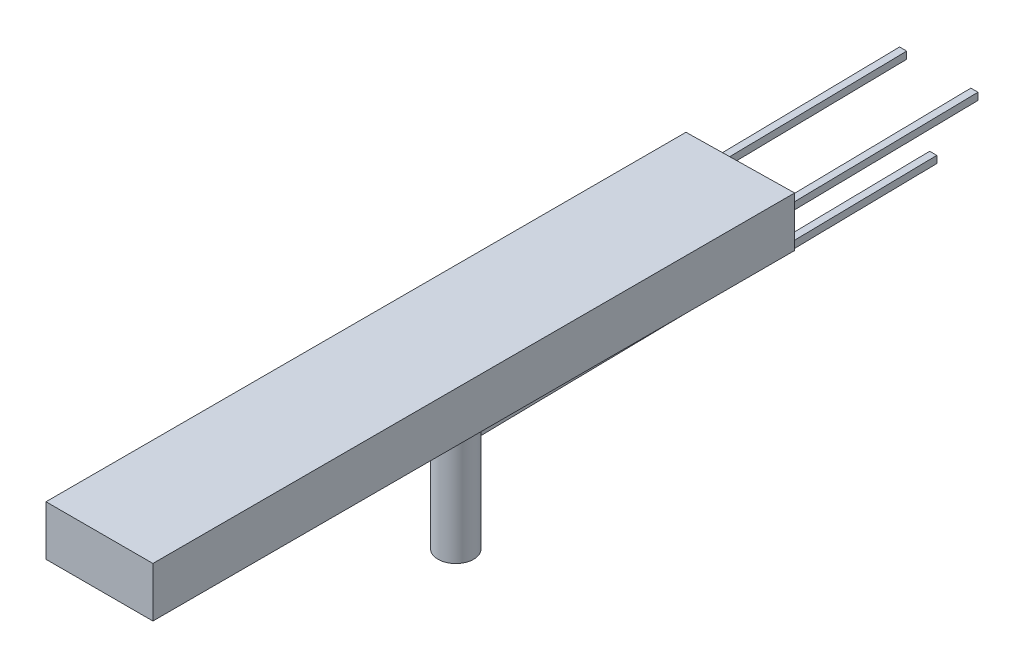
ISO-10303-21;
HEADER;
FILE_DESCRIPTION(('STEP AP214'),'2;1');
FILE_NAME('part.step','',(''),(''),'','','');
FILE_SCHEMA(('AUTOMOTIVE_DESIGN { 1 0 10303 214 1 1 1 1 }'));
ENDSEC;
DATA;
#1=APPLICATION_CONTEXT('core data for automotive mechanical design processes');
#2=APPLICATION_PROTOCOL_DEFINITION('international standard','automotive_design',2000,#1);
#3=PRODUCT_CONTEXT('',#1,'mechanical');
#4=PRODUCT('Part','Part','',(#3));
#5=PRODUCT_RELATED_PRODUCT_CATEGORY('part','',(#4));
#6=PRODUCT_DEFINITION_FORMATION('','',#4);
#7=PRODUCT_DEFINITION_CONTEXT('part definition',#1,'design');
#8=PRODUCT_DEFINITION('design','',#6,#7);
#9=PRODUCT_DEFINITION_SHAPE('','',#8);
#10=(LENGTH_UNIT() NAMED_UNIT(*) SI_UNIT(.MILLI.,.METRE.));
#11=(NAMED_UNIT(*) PLANE_ANGLE_UNIT() SI_UNIT($,.RADIAN.));
#12=(NAMED_UNIT(*) SI_UNIT($,.STERADIAN.) SOLID_ANGLE_UNIT());
#13=UNCERTAINTY_MEASURE_WITH_UNIT(LENGTH_MEASURE(1.E-05),#10,'distance_accuracy_value','');
#14=(GEOMETRIC_REPRESENTATION_CONTEXT(3) GLOBAL_UNCERTAINTY_ASSIGNED_CONTEXT((#13)) GLOBAL_UNIT_ASSIGNED_CONTEXT((#10,
#11,#12)) REPRESENTATION_CONTEXT('',''));
#15=CARTESIAN_POINT('',(0.,0.,0.));
#16=DIRECTION('',(0.,0.,1.));
#17=DIRECTION('',(1.,0.,0.));
#18=AXIS2_PLACEMENT_3D('',#15,#16,#17);
#19=CARTESIAN_POINT('',(6.7509066981884,11.8999999962747,14.9899999074595));
#20=DIRECTION('',(0.0165650611449047,0.,0.999862789961336));
#21=DIRECTION('',(0.999862789961336,0.,-0.0165650611449047));
#22=AXIS2_PLACEMENT_3D('',#19,#20,#21);
#23=PLANE('',#22);
#24=DIRECTION('',(0.,1.,0.));
#25=VECTOR('',#24,1.);
#26=CARTESIAN_POINT('',(1.09246615163893,11.8999999962747,15.0837451838909));
#27=LINE('',#26,#25);
#28=CARTESIAN_POINT('',(1.09246615163893,1.54829620804176,15.0837451838909));
#29=VERTEX_POINT('',#28);
#30=CARTESIAN_POINT('',(1.09246615163893,2.04829620804176,15.0837451838909));
#31=VERTEX_POINT('',#30);
#32=EDGE_CURVE('E257',#29,#31,#27,.T.);
#33=ORIENTED_EDGE('',*,*,#32,.F.);
#34=DIRECTION('',(0.999862789961335,0.,-0.0165650611449047));
#35=VECTOR('',#34,1.);
#36=CARTESIAN_POINT('',(6.7509066981884,1.54829620804176,14.9899999074595));
#37=LINE('',#36,#35);
#38=CARTESIAN_POINT('',(1.5923975466196,1.54829620804176,15.0754626533185));
#39=VERTEX_POINT('',#38);
#40=EDGE_CURVE('E255',#29,#39,#37,.T.);
#41=ORIENTED_EDGE('',*,*,#40,.T.);
#42=DIRECTION('',(0.,1.,0.));
#43=VECTOR('',#42,1.);
#44=CARTESIAN_POINT('',(1.5923975466196,11.8999999962747,15.0754626533185));
#45=LINE('',#44,#43);
#46=CARTESIAN_POINT('',(1.5923975466196,2.04829620804176,15.0754626533185));
#47=VERTEX_POINT('',#46);
#48=EDGE_CURVE('E253',#39,#47,#45,.T.);
#49=ORIENTED_EDGE('',*,*,#48,.T.);
#50=DIRECTION('',(0.999862789961335,0.,-0.0165650611449047));
#51=VECTOR('',#50,1.);
#52=CARTESIAN_POINT('',(6.7509066981884,2.04829620804176,14.9899999074595));
#53=LINE('',#52,#51);
#54=EDGE_CURVE('E250',#31,#47,#53,.T.);
#55=ORIENTED_EDGE('',*,*,#54,.F.);
#56=EDGE_LOOP('',(#33,#41,#49,#55));
#57=FACE_BOUND('',#56,.T.);
#58=DIRECTION('',(0.999862789961335,0.,-0.0165650611449047));
#59=VECTOR('',#58,1.);
#60=CARTESIAN_POINT('',(-0.136061863791688,3.50000010803342,15.1040986182803));
#61=LINE('',#60,#59);
#62=CARTESIAN_POINT('',(0.,3.50000010803342,15.1018444358906));
#63=VERTEX_POINT('',#62);
#64=CARTESIAN_POINT('',(7.49999983236194,3.50000010803342,14.9775894310468));
#65=VERTEX_POINT('',#64);
#66=EDGE_CURVE('E228',#63,#65,#61,.T.);
#67=ORIENTED_EDGE('',*,*,#66,.T.);
#68=DIRECTION('',(0.,-1.,0.));
#69=VECTOR('',#68,1.);
#70=CARTESIAN_POINT('',(7.49999983236194,3.50000010803342,14.9775894310468));
#71=LINE('',#70,#69);
#72=CARTESIAN_POINT('',(7.49999983236194,0.,14.9775894310468));
#73=VERTEX_POINT('',#72);
#74=EDGE_CURVE('E224',#65,#73,#71,.T.);
#75=ORIENTED_EDGE('',*,*,#74,.T.);
#76=DIRECTION('',(-0.999862789961335,0.,0.0165650611449047));
#77=VECTOR('',#76,1.);
#78=CARTESIAN_POINT('',(7.36187995923574,0.,14.9798777091652));
#79=LINE('',#78,#77);
#80=CARTESIAN_POINT('',(0.,0.,15.1018444358906));
#81=VERTEX_POINT('',#80);
#82=EDGE_CURVE('E227',#73,#81,#79,.T.);
#83=ORIENTED_EDGE('',*,*,#82,.T.);
#84=DIRECTION('',(0.,1.,0.));
#85=VECTOR('',#84,1.);
#86=CARTESIAN_POINT('',(0.,0.,15.1018444358906));
#87=LINE('',#86,#85);
#88=EDGE_CURVE('E232',#81,#63,#87,.T.);
#89=ORIENTED_EDGE('',*,*,#88,.T.);
#90=EDGE_LOOP('',(#67,#75,#83,#89));
#91=FACE_BOUND('',#90,.T.);
#92=DIRECTION('',(0.999862789961335,0.,-0.0165650611449047));
#93=VECTOR('',#92,1.);
#94=CARTESIAN_POINT('',(6.7509066981884,2.04829620804176,14.9899999074595));
#95=LINE('',#94,#93);
#96=CARTESIAN_POINT('',(6.09178010144394,2.04829620804176,15.0009198781664));
#97=VERTEX_POINT('',#96);
#98=CARTESIAN_POINT('',(6.59171149642461,2.04829620804177,14.992637347594));
#99=VERTEX_POINT('',#98);
#100=EDGE_CURVE('E11',#97,#99,#95,.T.);
#101=ORIENTED_EDGE('',*,*,#100,.F.);
#102=DIRECTION('',(0.,1.,0.));
#103=VECTOR('',#102,1.);
#104=CARTESIAN_POINT('',(6.09178010144394,11.8999999962747,15.0009198781664));
#105=LINE('',#104,#103);
#106=CARTESIAN_POINT('',(6.09178010144394,1.54829620804176,15.0009198781664));
#107=VERTEX_POINT('',#106);
#108=EDGE_CURVE('E49',#107,#97,#105,.T.);
#109=ORIENTED_EDGE('',*,*,#108,.F.);
#110=DIRECTION('',(0.999862789961335,0.,-0.0165650611449047));
#111=VECTOR('',#110,1.);
#112=CARTESIAN_POINT('',(6.7509066981884,1.54829620804176,14.9899999074595));
#113=LINE('',#112,#111);
#114=CARTESIAN_POINT('',(6.59171149642461,1.54829620804176,14.992637347594));
#115=VERTEX_POINT('',#114);
#116=EDGE_CURVE('E271',#107,#115,#113,.T.);
#117=ORIENTED_EDGE('',*,*,#116,.T.);
#118=DIRECTION('',(0.,1.,0.));
#119=VECTOR('',#118,1.);
#120=CARTESIAN_POINT('',(6.59171149642461,11.8999999962747,14.992637347594));
#121=LINE('',#120,#119);
#122=EDGE_CURVE('E156',#115,#99,#121,.T.);
#123=ORIENTED_EDGE('',*,*,#122,.T.);
#124=EDGE_LOOP('',(#101,#109,#117,#123));
#125=FACE_BOUND('',#124,.T.);
#126=ADVANCED_FACE('F41',(#57,#91,#125),#23,.F.);
#127=CARTESIAN_POINT('',(3.75000016356773,3.53553185540002,35.0000012364363));
#128=DIRECTION('',(0.,-1.,0.));
#129=DIRECTION('',(0.,0.,-1.));
#130=AXIS2_PLACEMENT_3D('',#127,#128,#129);
#131=CYLINDRICAL_SURFACE('',#130,1.2499992750272);
#132=CARTESIAN_POINT('',(3.75000016356773,0.,35.0000012364363));
#133=DIRECTION('',(0.,-1.,0.));
#134=DIRECTION('',(0.,0.,-1.));
#135=AXIS2_PLACEMENT_3D('',#132,#133,#134);
#136=CIRCLE('',#135,1.2499992750272);
#137=CARTESIAN_POINT('',(3.75000016356773,0.,33.7500019614091));
#138=VERTEX_POINT('',#137);
#139=EDGE_CURVE('E247',#138,#138,#136,.T.);
#140=ORIENTED_EDGE('',*,*,#139,.T.);
#141=EDGE_LOOP('',(#140));
#142=FACE_BOUND('',#141,.T.);
#143=CARTESIAN_POINT('',(3.75000016356773,-9.99999977648258,35.0000012364363));
#144=DIRECTION('',(0.,-1.,0.));
#145=DIRECTION('',(0.,0.,-1.));
#146=AXIS2_PLACEMENT_3D('',#143,#144,#145);
#147=CIRCLE('',#146,1.2499992750272);
#148=CARTESIAN_POINT('',(3.75000016356773,-9.99999977648258,33.7500019614091));
#149=VERTEX_POINT('',#148);
#150=EDGE_CURVE('E231',#149,#149,#147,.T.);
#151=ORIENTED_EDGE('',*,*,#150,.F.);
#152=EDGE_LOOP('',(#151));
#153=FACE_BOUND('',#152,.T.);
#154=CARTESIAN_POINT('',(3.75000016356773,-3.23405863238071,35.0000012364363));
#155=DIRECTION('',(0.,-1.,0.));
#156=DIRECTION('',(0.,0.,-1.));
#157=AXIS2_PLACEMENT_3D('',#154,#155,#156);
#158=CIRCLE('',#157,1.2499992750272);
#159=CARTESIAN_POINT('',(4.01132972852859,-3.23405863238071,33.7776244344453));
#160=VERTEX_POINT('',#159);
#161=CARTESIAN_POINT('',(3.51118494886003,-3.23405863238071,33.7730271206569));
#162=VERTEX_POINT('',#161);
#163=EDGE_CURVE('E260',#160,#162,#158,.F.);
#164=ORIENTED_EDGE('',*,*,#163,.T.);
#165=DIRECTION('',(0.,-1.,0.));
#166=VECTOR('',#165,1.);
#167=CARTESIAN_POINT('',(3.51118494886003,3.53553185540002,33.7730271206569));
#168=LINE('',#167,#166);
#169=CARTESIAN_POINT('',(3.51118494886003,-3.73405863238071,33.7730271206569));
#170=VERTEX_POINT('',#169);
#171=EDGE_CURVE('E267',#162,#170,#168,.T.);
#172=ORIENTED_EDGE('',*,*,#171,.T.);
#173=CARTESIAN_POINT('',(3.75000016356773,-3.73405863238071,35.0000012364363));
#174=DIRECTION('',(0.,-1.,0.));
#175=DIRECTION('',(1.,0.,0.));
#176=AXIS2_PLACEMENT_3D('',#173,#174,#175);
#177=CIRCLE('',#176,1.2499992750272);
#178=CARTESIAN_POINT('',(4.01132972852859,-3.73405863238071,33.7776244344453));
#179=VERTEX_POINT('',#178);
#180=EDGE_CURVE('E265',#179,#170,#177,.F.);
#181=ORIENTED_EDGE('',*,*,#180,.F.);
#182=DIRECTION('',(0.,-1.,0.));
#183=VECTOR('',#182,1.);
#184=CARTESIAN_POINT('',(4.01132972852859,3.53553185540002,33.7776244344453));
#185=LINE('',#184,#183);
#186=EDGE_CURVE('E263',#160,#179,#185,.T.);
#187=ORIENTED_EDGE('',*,*,#186,.F.);
#188=EDGE_LOOP('',(#164,#172,#181,#187));
#189=FACE_BOUND('',#188,.T.);
#190=ADVANCED_FACE('F283',(#142,#153,#189),#131,.T.);
#191=CARTESIAN_POINT('',(7.49999983236194,0.,78.2764728704216));
#192=DIRECTION('',(0.,-1.,0.));
#193=DIRECTION('',(0.,0.,-1.));
#194=AXIS2_PLACEMENT_3D('',#191,#192,#193);
#195=PLANE('',#194);
#196=ORIENTED_EDGE('',*,*,#139,.F.);
#197=EDGE_LOOP('',(#196));
#198=FACE_BOUND('',#197,.T.);
#199=DIRECTION('',(0.,0.,-1.));
#200=VECTOR('',#199,1.);
#201=CARTESIAN_POINT('',(7.49999983236194,0.,78.2764728704216));
#202=LINE('',#201,#200);
#203=CARTESIAN_POINT('',(7.49999983236194,0.,60.0000002980232));
#204=VERTEX_POINT('',#203);
#205=EDGE_CURVE('E242',#204,#73,#202,.T.);
#206=ORIENTED_EDGE('',*,*,#205,.F.);
#207=DIRECTION('',(1.,0.,0.));
#208=VECTOR('',#207,1.);
#209=CARTESIAN_POINT('',(0.,0.,60.0000002980232));
#210=LINE('',#209,#208);
#211=CARTESIAN_POINT('',(0.,0.,60.0000002980232));
#212=VERTEX_POINT('',#211);
#213=EDGE_CURVE('E218',#212,#204,#210,.T.);
#214=ORIENTED_EDGE('',*,*,#213,.F.);
#215=DIRECTION('',(0.,0.,-1.));
#216=VECTOR('',#215,1.);
#217=CARTESIAN_POINT('',(0.,0.,78.2764728704216));
#218=LINE('',#217,#216);
#219=EDGE_CURVE('E239',#212,#81,#218,.T.);
#220=ORIENTED_EDGE('',*,*,#219,.T.);
#221=ORIENTED_EDGE('',*,*,#82,.F.);
#222=EDGE_LOOP('',(#206,#214,#220,#221));
#223=FACE_BOUND('',#222,.T.);
#224=ADVANCED_FACE('F43',(#198,#223),#195,.T.);
#225=CARTESIAN_POINT('',(0.,3.50000010803342,78.2764728704216));
#226=DIRECTION('',(-1.,0.,0.));
#227=DIRECTION('',(0.,0.,1.));
#228=AXIS2_PLACEMENT_3D('',#225,#226,#227);
#229=PLANE('',#228);
#230=ORIENTED_EDGE('',*,*,#219,.F.);
#231=DIRECTION('',(0.,-1.,0.));
#232=VECTOR('',#231,1.);
#233=CARTESIAN_POINT('',(0.,3.50000010803342,60.0000002980232));
#234=LINE('',#233,#232);
#235=CARTESIAN_POINT('',(0.,3.50000010803342,60.0000002980232));
#236=VERTEX_POINT('',#235);
#237=EDGE_CURVE('E211',#236,#212,#234,.T.);
#238=ORIENTED_EDGE('',*,*,#237,.F.);
#239=DIRECTION('',(0.,0.,-1.));
#240=VECTOR('',#239,1.);
#241=CARTESIAN_POINT('',(0.,3.50000010803342,78.2764728704216));
#242=LINE('',#241,#240);
#243=EDGE_CURVE('E243',#236,#63,#242,.T.);
#244=ORIENTED_EDGE('',*,*,#243,.T.);
#245=ORIENTED_EDGE('',*,*,#88,.F.);
#246=EDGE_LOOP('',(#230,#238,#244,#245));
#247=FACE_BOUND('',#246,.T.);
#248=ADVANCED_FACE('F308',(#247),#229,.T.);
#249=CARTESIAN_POINT('',(7.49999983236194,3.50000010803342,78.2764728704216));
#250=DIRECTION('',(0.,1.,0.));
#251=DIRECTION('',(0.,0.,1.));
#252=AXIS2_PLACEMENT_3D('',#249,#250,#251);
#253=PLANE('',#252);
#254=ORIENTED_EDGE('',*,*,#243,.F.);
#255=DIRECTION('',(-1.,0.,0.));
#256=VECTOR('',#255,1.);
#257=CARTESIAN_POINT('',(0.,3.50000010803342,60.0000002980232));
#258=LINE('',#257,#256);
#259=CARTESIAN_POINT('',(7.49999983236194,3.50000010803342,60.0000002980232));
#260=VERTEX_POINT('',#259);
#261=EDGE_CURVE('E222',#260,#236,#258,.T.);
#262=ORIENTED_EDGE('',*,*,#261,.F.);
#263=DIRECTION('',(0.,0.,-1.));
#264=VECTOR('',#263,1.);
#265=CARTESIAN_POINT('',(7.49999983236194,3.50000010803342,78.2764728704216));
#266=LINE('',#265,#264);
#267=EDGE_CURVE('E240',#260,#65,#266,.T.);
#268=ORIENTED_EDGE('',*,*,#267,.T.);
#269=ORIENTED_EDGE('',*,*,#66,.F.);
#270=EDGE_LOOP('',(#254,#262,#268,#269));
#271=FACE_BOUND('',#270,.T.);
#272=ADVANCED_FACE('F305',(#271),#253,.T.);
#273=CARTESIAN_POINT('',(7.49999983236194,3.50000010803342,78.2764728704216));
#274=DIRECTION('',(1.,0.,0.));
#275=DIRECTION('',(0.,0.,-1.));
#276=AXIS2_PLACEMENT_3D('',#273,#274,#275);
#277=PLANE('',#276);
#278=ORIENTED_EDGE('',*,*,#267,.F.);
#279=DIRECTION('',(0.,1.,0.));
#280=VECTOR('',#279,1.);
#281=CARTESIAN_POINT('',(7.49999983236194,3.50000010803342,60.0000002980232));
#282=LINE('',#281,#280);
#283=EDGE_CURVE('E220',#204,#260,#282,.T.);
#284=ORIENTED_EDGE('',*,*,#283,.F.);
#285=ORIENTED_EDGE('',*,*,#205,.T.);
#286=ORIENTED_EDGE('',*,*,#74,.F.);
#287=EDGE_LOOP('',(#278,#284,#285,#286));
#288=FACE_BOUND('',#287,.T.);
#289=ADVANCED_FACE('F300',(#288),#277,.T.);
#290=CARTESIAN_POINT('',(3.75000016356773,-9.99999977648258,35.0000012364363));
#291=DIRECTION('',(0.,-1.,0.));
#292=DIRECTION('',(0.,0.,-1.));
#293=AXIS2_PLACEMENT_3D('',#290,#291,#292);
#294=PLANE('',#293);
#295=ORIENTED_EDGE('',*,*,#150,.T.);
#296=EDGE_LOOP('',(#295));
#297=FACE_BOUND('',#296,.T.);
#298=ADVANCED_FACE('F298',(#297),#294,.T.);
#299=CARTESIAN_POINT('',(0.,0.,60.0000002980232));
#300=DIRECTION('',(0.,0.,1.));
#301=DIRECTION('',(1.,0.,0.));
#302=AXIS2_PLACEMENT_3D('',#299,#300,#301);
#303=PLANE('',#302);
#304=ORIENTED_EDGE('',*,*,#237,.T.);
#305=ORIENTED_EDGE('',*,*,#213,.T.);
#306=ORIENTED_EDGE('',*,*,#283,.T.);
#307=ORIENTED_EDGE('',*,*,#261,.T.);
#308=EDGE_LOOP('',(#304,#305,#306,#307));
#309=FACE_BOUND('',#308,.T.);
#310=ADVANCED_FACE('F296',(#309),#303,.T.);
#311=CARTESIAN_POINT('',(1.42376737453702,0.,35.0810009831177));
#312=DIRECTION('',(0.999862789961335,0.,-0.0165650611449047));
#313=DIRECTION('',(-0.0165650611449047,0.,-0.999862789961336));
#314=AXIS2_PLACEMENT_3D('',#311,#312,#313);
#315=PLANE('',#314);
#316=DIRECTION('',(-0.0165650611449047,0.,-0.999862789961335));
#317=VECTOR('',#316,1.);
#318=CARTESIAN_POINT('',(1.42376737453702,1.54829620804176,35.0810009831177));
#319=LINE('',#318,#317);
#320=CARTESIAN_POINT('',(0.858689989155127,1.54829620804176,0.973076711084937));
#321=VERTEX_POINT('',#320);
#322=EDGE_CURVE('E209',#29,#321,#319,.T.);
#323=ORIENTED_EDGE('',*,*,#322,.F.);
#324=ORIENTED_EDGE('',*,*,#32,.T.);
#325=DIRECTION('',(-0.0165650611449047,0.,-0.999862789961335));
#326=VECTOR('',#325,1.);
#327=CARTESIAN_POINT('',(1.42376737453702,2.04829620804176,35.0810009831177));
#328=LINE('',#327,#326);
#329=CARTESIAN_POINT('',(0.858689989155127,2.04829620804176,0.973076711084937));
#330=VERTEX_POINT('',#329);
#331=EDGE_CURVE('E206',#31,#330,#328,.T.);
#332=ORIENTED_EDGE('',*,*,#331,.T.);
#333=DIRECTION('',(0.,1.,0.));
#334=VECTOR('',#333,1.);
#335=CARTESIAN_POINT('',(0.858689989155127,0.,0.973076711084937));
#336=LINE('',#335,#334);
#337=EDGE_CURVE('E203',#321,#330,#336,.T.);
#338=ORIENTED_EDGE('',*,*,#337,.F.);
#339=EDGE_LOOP('',(#323,#324,#332,#338));
#340=FACE_BOUND('',#339,.T.);
#341=ADVANCED_FACE('F330',(#340),#315,.F.);
#342=CARTESIAN_POINT('',(0.581429874509444,1.54829620804176,35.0949562701157));
#343=DIRECTION('',(0.,-1.,0.));
#344=DIRECTION('',(0.,0.,-1.));
#345=AXIS2_PLACEMENT_3D('',#342,#343,#344);
#346=PLANE('',#345);
#347=ORIENTED_EDGE('',*,*,#40,.F.);
#348=ORIENTED_EDGE('',*,*,#322,.T.);
#349=DIRECTION('',(1.,0.,0.));
#350=VECTOR('',#349,1.);
#351=CARTESIAN_POINT('',(0.00470702808865052,1.54829620804176,0.973076711084934));
#352=LINE('',#351,#350);
#353=CARTESIAN_POINT('',(1.35875860358905,1.54829620804176,0.973076711084939));
#354=VERTEX_POINT('',#353);
#355=EDGE_CURVE('E188',#321,#354,#352,.T.);
#356=ORIENTED_EDGE('',*,*,#355,.T.);
#357=DIRECTION('',(-0.0165650611449047,0.,-0.999862789961335));
#358=VECTOR('',#357,1.);
#359=CARTESIAN_POINT('',(1.92369876951769,1.54829620804176,35.0727184525452));
#360=LINE('',#359,#358);
#361=EDGE_CURVE('E212',#39,#354,#360,.T.);
#362=ORIENTED_EDGE('',*,*,#361,.F.);
#363=EDGE_LOOP('',(#347,#348,#356,#362));
#364=FACE_BOUND('',#363,.T.);
#365=ADVANCED_FACE('F334',(#364),#346,.T.);
#366=CARTESIAN_POINT('',(1.92369876951769,0.,35.0727184525452));
#367=DIRECTION('',(0.999862789961335,0.,-0.0165650611449047));
#368=DIRECTION('',(-0.0165650611449047,0.,-0.999862789961336));
#369=AXIS2_PLACEMENT_3D('',#366,#367,#368);
#370=PLANE('',#369);
#371=ORIENTED_EDGE('',*,*,#48,.F.);
#372=ORIENTED_EDGE('',*,*,#361,.T.);
#373=DIRECTION('',(0.,1.,0.));
#374=VECTOR('',#373,1.);
#375=CARTESIAN_POINT('',(1.35875860358905,0.,0.973076711084938));
#376=LINE('',#375,#374);
#377=CARTESIAN_POINT('',(1.35875860358905,2.04829620804176,0.973076711084938));
#378=VERTEX_POINT('',#377);
#379=EDGE_CURVE('E197',#354,#378,#376,.T.);
#380=ORIENTED_EDGE('',*,*,#379,.T.);
#381=DIRECTION('',(-0.0165650611449047,0.,-0.999862789961335));
#382=VECTOR('',#381,1.);
#383=CARTESIAN_POINT('',(1.92369876951769,2.04829620804176,35.0727184525452));
#384=LINE('',#383,#382);
#385=EDGE_CURVE('E214',#47,#378,#384,.T.);
#386=ORIENTED_EDGE('',*,*,#385,.F.);
#387=EDGE_LOOP('',(#371,#372,#380,#386));
#388=FACE_BOUND('',#387,.T.);
#389=ADVANCED_FACE('F339',(#388),#370,.T.);
#390=CARTESIAN_POINT('',(0.581429874509444,2.04829620804176,35.0949562701157));
#391=DIRECTION('',(0.,-1.,0.));
#392=DIRECTION('',(0.,0.,-1.));
#393=AXIS2_PLACEMENT_3D('',#390,#391,#392);
#394=PLANE('',#393);
#395=ORIENTED_EDGE('',*,*,#331,.F.);
#396=ORIENTED_EDGE('',*,*,#54,.T.);
#397=ORIENTED_EDGE('',*,*,#385,.T.);
#398=DIRECTION('',(1.,0.,0.));
#399=VECTOR('',#398,1.);
#400=CARTESIAN_POINT('',(0.00470702808865052,2.04829620804176,0.973076711084934));
#401=LINE('',#400,#399);
#402=EDGE_CURVE('E200',#330,#378,#401,.T.);
#403=ORIENTED_EDGE('',*,*,#402,.F.);
#404=EDGE_LOOP('',(#395,#396,#397,#403));
#405=FACE_BOUND('',#404,.T.);
#406=ADVANCED_FACE('F344',(#405),#394,.F.);
#407=CARTESIAN_POINT('',(42.1298998958449,-48.9432646556353,0.973076711085069));
#408=DIRECTION('',(0.,0.,1.));
#409=DIRECTION('',(1.,0.,0.));
#410=AXIS2_PLACEMENT_3D('',#407,#408,#409);
#411=PLANE('',#410);
#412=ORIENTED_EDGE('',*,*,#337,.T.);
#413=ORIENTED_EDGE('',*,*,#402,.T.);
#414=ORIENTED_EDGE('',*,*,#379,.F.);
#415=ORIENTED_EDGE('',*,*,#355,.F.);
#416=EDGE_LOOP('',(#412,#413,#414,#415));
#417=FACE_BOUND('',#416,.T.);
#418=ADVANCED_FACE('F347',(#417),#411,.F.);
#419=CARTESIAN_POINT('',(3.53227585299013,0.,35.0460686181716));
#420=DIRECTION('',(0.999862789961335,0.,-0.0165650611449047));
#421=DIRECTION('',(-0.0165650611449047,0.,-0.999862789961336));
#422=AXIS2_PLACEMENT_3D('',#419,#420,#421);
#423=PLANE('',#422);
#424=ORIENTED_EDGE('',*,*,#171,.F.);
#425=DIRECTION('',(-0.0165650611449047,0.,-0.999862789961335));
#426=VECTOR('',#425,1.);
#427=CARTESIAN_POINT('',(3.53227585299013,-3.23405863238071,35.0460686181716));
#428=LINE('',#427,#426);
#429=CARTESIAN_POINT('',(2.96777720377791,-3.23405863238071,0.973076711084944));
#430=VERTEX_POINT('',#429);
#431=EDGE_CURVE('E63',#162,#430,#428,.T.);
#432=ORIENTED_EDGE('',*,*,#431,.T.);
#433=DIRECTION('',(0.,1.,0.));
#434=VECTOR('',#433,1.);
#435=CARTESIAN_POINT('',(2.96777720377791,0.,0.973076711084944));
#436=LINE('',#435,#434);
#437=CARTESIAN_POINT('',(2.96777720377791,-3.73405863238071,0.973076711084944));
#438=VERTEX_POINT('',#437);
#439=EDGE_CURVE('E181',#438,#430,#436,.T.);
#440=ORIENTED_EDGE('',*,*,#439,.F.);
#441=DIRECTION('',(-0.0165650611449047,0.,-0.999862789961335));
#442=VECTOR('',#441,1.);
#443=CARTESIAN_POINT('',(3.53227585299013,-3.73405863238071,35.0460686181716));
#444=LINE('',#443,#442);
#445=EDGE_CURVE('E174',#170,#438,#444,.T.);
#446=ORIENTED_EDGE('',*,*,#445,.F.);
#447=EDGE_LOOP('',(#424,#432,#440,#446));
#448=FACE_BOUND('',#447,.T.);
#449=ADVANCED_FACE('F354',(#448),#423,.F.);
#450=CARTESIAN_POINT('',(0.581429874510172,-3.73405863238071,35.0949562701157));
#451=DIRECTION('',(0.,-1.,0.));
#452=DIRECTION('',(1.,0.,0.));
#453=AXIS2_PLACEMENT_3D('',#450,#451,#452);
#454=PLANE('',#453);
#455=DIRECTION('',(-0.0165650611449047,0.,-0.999862789961335));
#456=VECTOR('',#455,1.);
#457=CARTESIAN_POINT('',(4.0322072479708,-3.73405863238071,35.0377860875992));
#458=LINE('',#457,#456);
#459=CARTESIAN_POINT('',(3.46784581821183,-3.73405863238071,0.973076711084945));
#460=VERTEX_POINT('',#459);
#461=EDGE_CURVE('E176',#179,#460,#458,.T.);
#462=ORIENTED_EDGE('',*,*,#461,.F.);
#463=ORIENTED_EDGE('',*,*,#180,.T.);
#464=ORIENTED_EDGE('',*,*,#445,.T.);
#465=DIRECTION('',(1.,0.,0.));
#466=VECTOR('',#465,1.);
#467=CARTESIAN_POINT('',(0.0047070280893791,-3.73405863238071,0.973076711084934));
#468=LINE('',#467,#466);
#469=EDGE_CURVE('E185',#438,#460,#468,.T.);
#470=ORIENTED_EDGE('',*,*,#469,.T.);
#471=EDGE_LOOP('',(#462,#463,#464,#470));
#472=FACE_BOUND('',#471,.T.);
#473=ADVANCED_FACE('F361',(#472),#454,.T.);
#474=CARTESIAN_POINT('',(4.0322072479708,0.,35.0377860875992));
#475=DIRECTION('',(0.999862789961335,0.,-0.0165650611449047));
#476=DIRECTION('',(-0.0165650611449047,0.,-0.999862789961336));
#477=AXIS2_PLACEMENT_3D('',#474,#475,#476);
#478=PLANE('',#477);
#479=DIRECTION('',(-0.0165650611449047,0.,-0.999862789961335));
#480=VECTOR('',#479,1.);
#481=CARTESIAN_POINT('',(4.0322072479708,-3.23405863238071,35.0377860875992));
#482=LINE('',#481,#480);
#483=CARTESIAN_POINT('',(3.46784581821183,-3.23405863238071,0.973076711084945));
#484=VERTEX_POINT('',#483);
#485=EDGE_CURVE('E182',#160,#484,#482,.T.);
#486=ORIENTED_EDGE('',*,*,#485,.F.);
#487=ORIENTED_EDGE('',*,*,#186,.T.);
#488=ORIENTED_EDGE('',*,*,#461,.T.);
#489=DIRECTION('',(0.,1.,0.));
#490=VECTOR('',#489,1.);
#491=CARTESIAN_POINT('',(3.46784581821183,0.,0.973076711084945));
#492=LINE('',#491,#490);
#493=EDGE_CURVE('E189',#460,#484,#492,.T.);
#494=ORIENTED_EDGE('',*,*,#493,.T.);
#495=EDGE_LOOP('',(#486,#487,#488,#494));
#496=FACE_BOUND('',#495,.T.);
#497=ADVANCED_FACE('F364',(#496),#478,.T.);
#498=CARTESIAN_POINT('',(0.581429874510172,-3.23405863238071,35.0949562701157));
#499=DIRECTION('',(0.,-1.,0.));
#500=DIRECTION('',(0.,0.,-1.));
#501=AXIS2_PLACEMENT_3D('',#498,#499,#500);
#502=PLANE('',#501);
#503=ORIENTED_EDGE('',*,*,#163,.F.);
#504=ORIENTED_EDGE('',*,*,#485,.T.);
#505=DIRECTION('',(1.,0.,0.));
#506=VECTOR('',#505,1.);
#507=CARTESIAN_POINT('',(0.0047070280893791,-3.23405863238071,0.973076711084934));
#508=LINE('',#507,#506);
#509=EDGE_CURVE('E192',#430,#484,#508,.T.);
#510=ORIENTED_EDGE('',*,*,#509,.F.);
#511=ORIENTED_EDGE('',*,*,#431,.F.);
#512=EDGE_LOOP('',(#503,#504,#510,#511));
#513=FACE_BOUND('',#512,.T.);
#514=ADVANCED_FACE('F359',(#513),#502,.F.);
#515=CARTESIAN_POINT('',(42.1298998958449,-48.9432646556353,0.973076711085069));
#516=DIRECTION('',(0.,0.,1.));
#517=DIRECTION('',(1.,0.,0.));
#518=AXIS2_PLACEMENT_3D('',#515,#516,#517);
#519=PLANE('',#518);
#520=ORIENTED_EDGE('',*,*,#439,.T.);
#521=ORIENTED_EDGE('',*,*,#509,.T.);
#522=ORIENTED_EDGE('',*,*,#493,.F.);
#523=ORIENTED_EDGE('',*,*,#469,.F.);
#524=EDGE_LOOP('',(#520,#521,#522,#523));
#525=FACE_BOUND('',#524,.T.);
#526=ADVANCED_FACE('F356',(#525),#519,.F.);
#527=CARTESIAN_POINT('',(6.9230127193227,2.04829620804177,34.9898931468207));
#528=DIRECTION('',(0.,-1.,0.));
#529=DIRECTION('',(0.,0.,-1.));
#530=AXIS2_PLACEMENT_3D('',#527,#528,#529);
#531=PLANE('',#530);
#532=DIRECTION('',(-0.0165650611449047,0.,-0.999862789961335));
#533=VECTOR('',#532,1.);
#534=CARTESIAN_POINT('',(6.42308132434204,2.04829620804177,34.9981756773931));
#535=LINE('',#534,#533);
#536=CARTESIAN_POINT('',(5.85937613349268,2.04829620804176,0.973076711084953));
#537=VERTEX_POINT('',#536);
#538=EDGE_CURVE('E276',#97,#537,#535,.T.);
#539=ORIENTED_EDGE('',*,*,#538,.F.);
#540=ORIENTED_EDGE('',*,*,#100,.T.);
#541=DIRECTION('',(-0.0165650611449047,0.,-0.999862789961335));
#542=VECTOR('',#541,1.);
#543=CARTESIAN_POINT('',(6.9230127193227,2.04829620804177,34.9898931468207));
#544=LINE('',#543,#542);
#545=CARTESIAN_POINT('',(6.3594447479266,2.04829620804176,0.973076711084955));
#546=VERTEX_POINT('',#545);
#547=EDGE_CURVE('E56',#99,#546,#544,.T.);
#548=ORIENTED_EDGE('',*,*,#547,.T.);
#549=DIRECTION('',(1.,0.,0.));
#550=VECTOR('',#549,1.);
#551=CARTESIAN_POINT('',(6.34628987290191,2.04829620804176,0.973076711084955));
#552=LINE('',#551,#550);
#553=EDGE_CURVE('E170',#537,#546,#552,.T.);
#554=ORIENTED_EDGE('',*,*,#553,.F.);
#555=EDGE_LOOP('',(#539,#540,#548,#554));
#556=FACE_BOUND('',#555,.T.);
#557=ADVANCED_FACE('F280',(#556),#531,.F.);
#558=CARTESIAN_POINT('',(6.42308132434204,2.04829620804177,34.9981756773931));
#559=DIRECTION('',(0.999862789961335,0.,-0.0165650611449047));
#560=DIRECTION('',(-0.0165650611449047,0.,-0.999862789961336));
#561=AXIS2_PLACEMENT_3D('',#558,#559,#560);
#562=PLANE('',#561);
#563=DIRECTION('',(-0.0165650611449047,0.,-0.999862789961335));
#564=VECTOR('',#563,1.);
#565=CARTESIAN_POINT('',(6.42308132434204,1.54829620804177,34.9981756773931));
#566=LINE('',#565,#564);
#567=CARTESIAN_POINT('',(5.85937613349268,1.54829620804176,0.973076711084953));
#568=VERTEX_POINT('',#567);
#569=EDGE_CURVE('E160',#107,#568,#566,.T.);
#570=ORIENTED_EDGE('',*,*,#569,.F.);
#571=ORIENTED_EDGE('',*,*,#108,.T.);
#572=ORIENTED_EDGE('',*,*,#538,.T.);
#573=DIRECTION('',(0.,1.,0.));
#574=VECTOR('',#573,1.);
#575=CARTESIAN_POINT('',(5.85937613349268,2.04829620804176,0.973076711084953));
#576=LINE('',#575,#574);
#577=EDGE_CURVE('E582',#568,#537,#576,.T.);
#578=ORIENTED_EDGE('',*,*,#577,.F.);
#579=EDGE_LOOP('',(#570,#571,#572,#578));
#580=FACE_BOUND('',#579,.T.);
#581=ADVANCED_FACE('F275',(#580),#562,.F.);
#582=CARTESIAN_POINT('',(6.9230127193227,1.54829620804177,34.9898931468207));
#583=DIRECTION('',(0.,-1.,0.));
#584=DIRECTION('',(0.,0.,-1.));
#585=AXIS2_PLACEMENT_3D('',#582,#583,#584);
#586=PLANE('',#585);
#587=ORIENTED_EDGE('',*,*,#116,.F.);
#588=ORIENTED_EDGE('',*,*,#569,.T.);
#589=DIRECTION('',(1.,0.,0.));
#590=VECTOR('',#589,1.);
#591=CARTESIAN_POINT('',(6.34628987290191,1.54829620804176,0.973076711084955));
#592=LINE('',#591,#590);
#593=CARTESIAN_POINT('',(6.3594447479266,1.54829620804176,0.973076711084954));
#594=VERTEX_POINT('',#593);
#595=EDGE_CURVE('E167',#568,#594,#592,.T.);
#596=ORIENTED_EDGE('',*,*,#595,.T.);
#597=DIRECTION('',(-0.0165650611449047,0.,-0.999862789961335));
#598=VECTOR('',#597,1.);
#599=CARTESIAN_POINT('',(6.9230127193227,1.54829620804177,34.9898931468207));
#600=LINE('',#599,#598);
#601=EDGE_CURVE('E151',#115,#594,#600,.T.);
#602=ORIENTED_EDGE('',*,*,#601,.F.);
#603=EDGE_LOOP('',(#587,#588,#596,#602));
#604=FACE_BOUND('',#603,.T.);
#605=ADVANCED_FACE('F172',(#604),#586,.T.);
#606=CARTESIAN_POINT('',(6.9230127193227,2.04829620804177,34.9898931468207));
#607=DIRECTION('',(0.999862789961335,0.,-0.0165650611449047));
#608=DIRECTION('',(-0.0165650611449047,0.,-0.999862789961336));
#609=AXIS2_PLACEMENT_3D('',#606,#607,#608);
#610=PLANE('',#609);
#611=ORIENTED_EDGE('',*,*,#122,.F.);
#612=ORIENTED_EDGE('',*,*,#601,.T.);
#613=DIRECTION('',(0.,1.,0.));
#614=VECTOR('',#613,1.);
#615=CARTESIAN_POINT('',(6.3594447479266,2.04829620804176,0.973076711084955));
#616=LINE('',#615,#614);
#617=EDGE_CURVE('E154',#594,#546,#616,.T.);
#618=ORIENTED_EDGE('',*,*,#617,.T.);
#619=ORIENTED_EDGE('',*,*,#547,.F.);
#620=EDGE_LOOP('',(#611,#612,#618,#619));
#621=FACE_BOUND('',#620,.T.);
#622=ADVANCED_FACE('F153',(#621),#610,.T.);
#623=CARTESIAN_POINT('',(42.1298998958449,-48.9432646556353,0.973076711085069));
#624=DIRECTION('',(0.,0.,1.));
#625=DIRECTION('',(1.,0.,0.));
#626=AXIS2_PLACEMENT_3D('',#623,#624,#625);
#627=PLANE('',#626);
#628=ORIENTED_EDGE('',*,*,#553,.T.);
#629=ORIENTED_EDGE('',*,*,#617,.F.);
#630=ORIENTED_EDGE('',*,*,#595,.F.);
#631=ORIENTED_EDGE('',*,*,#577,.T.);
#632=EDGE_LOOP('',(#628,#629,#630,#631));
#633=FACE_BOUND('',#632,.T.);
#634=ADVANCED_FACE('F165',(#633),#627,.F.);
#635=CLOSED_SHELL('',(#126,#190,#224,#248,#272,#289,#298,#310,#341,#365,#389,#406,#418,#449,
#473,#497,#514,#526,#557,#581,#605,#622,#634));
#636=MANIFOLD_SOLID_BREP('B2',#635);
#637=ADVANCED_BREP_SHAPE_REPRESENTATION('',(#18,#636),#14);
#638=SHAPE_DEFINITION_REPRESENTATION(#9,#637);
ENDSEC;
END-ISO-10303-21;
